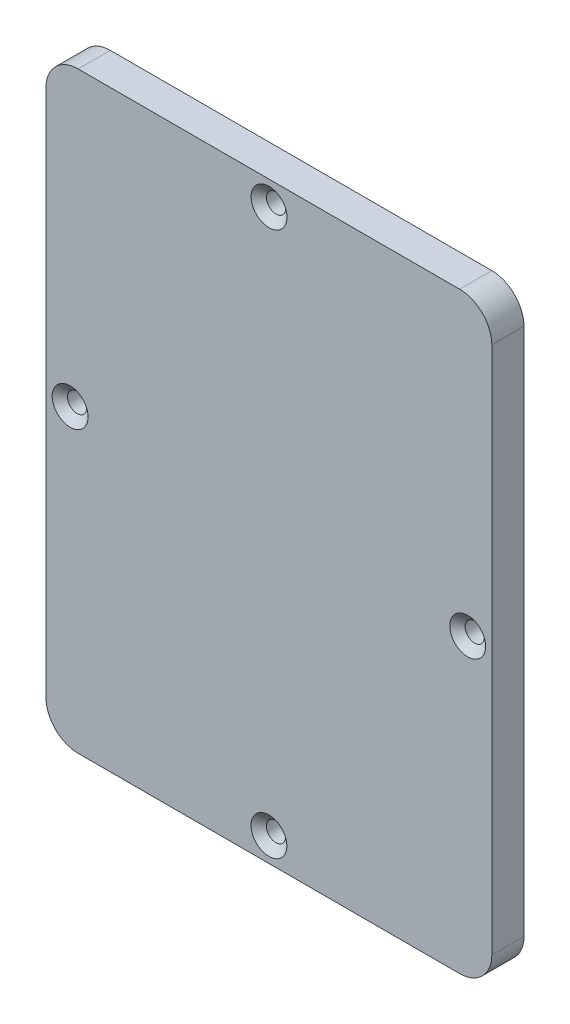
ISO-10303-21;
HEADER;
FILE_DESCRIPTION(('STEP AP214'),'2;1');
FILE_NAME('part.step','',(''),(''),'','','');
FILE_SCHEMA(('AUTOMOTIVE_DESIGN { 1 0 10303 214 1 1 1 1 }'));
ENDSEC;
DATA;
#1=APPLICATION_CONTEXT('core data for automotive mechanical design processes');
#2=APPLICATION_PROTOCOL_DEFINITION('international standard','automotive_design',2000,#1);
#3=PRODUCT_CONTEXT('',#1,'mechanical');
#4=PRODUCT('Part','Part','',(#3));
#5=PRODUCT_RELATED_PRODUCT_CATEGORY('part','',(#4));
#6=PRODUCT_DEFINITION_FORMATION('','',#4);
#7=PRODUCT_DEFINITION_CONTEXT('part definition',#1,'design');
#8=PRODUCT_DEFINITION('design','',#6,#7);
#9=PRODUCT_DEFINITION_SHAPE('','',#8);
#10=(LENGTH_UNIT() NAMED_UNIT(*) SI_UNIT(.MILLI.,.METRE.));
#11=(NAMED_UNIT(*) PLANE_ANGLE_UNIT() SI_UNIT($,.RADIAN.));
#12=(NAMED_UNIT(*) SI_UNIT($,.STERADIAN.) SOLID_ANGLE_UNIT());
#13=UNCERTAINTY_MEASURE_WITH_UNIT(LENGTH_MEASURE(1.E-05),#10,'distance_accuracy_value','');
#14=(GEOMETRIC_REPRESENTATION_CONTEXT(3) GLOBAL_UNCERTAINTY_ASSIGNED_CONTEXT((#13)) GLOBAL_UNIT_ASSIGNED_CONTEXT((#10,
#11,#12)) REPRESENTATION_CONTEXT('',''));
#15=CARTESIAN_POINT('',(0.,0.,0.));
#16=DIRECTION('',(0.,0.,1.));
#17=DIRECTION('',(1.,0.,0.));
#18=AXIS2_PLACEMENT_3D('',#15,#16,#17);
#19=CARTESIAN_POINT('',(0.,6.34999999999997,6.35));
#20=DIRECTION('',(0.,0.,1.));
#21=DIRECTION('',(1.,0.,0.));
#22=AXIS2_PLACEMENT_3D('',#19,#20,#21);
#23=PLANE('',#22);
#24=CARTESIAN_POINT('',(-1.58750000000013,58.5,6.35));
#25=DIRECTION('',(0.,0.,1.));
#26=DIRECTION('',(1.,0.,0.));
#27=AXIS2_PLACEMENT_3D('',#24,#25,#26);
#28=CIRCLE('',#27,3.5433);
#29=CARTESIAN_POINT('',(1.95579999999987,58.5,6.35));
#30=VERTEX_POINT('',#29);
#31=EDGE_CURVE('E209',#30,#30,#28,.T.);
#32=ORIENTED_EDGE('',*,*,#31,.F.);
#33=EDGE_LOOP('',(#32));
#34=FACE_BOUND('',#33,.T.);
#35=CARTESIAN_POINT('',(37.6737898081058,112.2375,6.35));
#36=DIRECTION('',(0.,0.,1.));
#37=DIRECTION('',(1.,0.,0.));
#38=AXIS2_PLACEMENT_3D('',#35,#36,#37);
#39=CIRCLE('',#38,3.5433);
#40=CARTESIAN_POINT('',(41.2170898081058,112.2375,6.35));
#41=VERTEX_POINT('',#40);
#42=EDGE_CURVE('E200',#41,#41,#39,.T.);
#43=ORIENTED_EDGE('',*,*,#42,.F.);
#44=EDGE_LOOP('',(#43));
#45=FACE_BOUND('',#44,.T.);
#46=CARTESIAN_POINT('',(76.8874999999999,58.5,6.35));
#47=DIRECTION('',(0.,0.,1.));
#48=DIRECTION('',(1.,0.,0.));
#49=AXIS2_PLACEMENT_3D('',#46,#47,#48);
#50=CIRCLE('',#49,3.5433);
#51=CARTESIAN_POINT('',(80.4307999999999,58.5,6.35));
#52=VERTEX_POINT('',#51);
#53=EDGE_CURVE('E191',#52,#52,#50,.T.);
#54=ORIENTED_EDGE('',*,*,#53,.F.);
#55=EDGE_LOOP('',(#54));
#56=FACE_BOUND('',#55,.T.);
#57=CARTESIAN_POINT('',(37.6499999999999,4.7625,6.35));
#58=DIRECTION('',(0.,0.,1.));
#59=DIRECTION('',(1.,0.,0.));
#60=AXIS2_PLACEMENT_3D('',#57,#58,#59);
#61=CIRCLE('',#60,3.5433);
#62=CARTESIAN_POINT('',(41.1932999999999,4.7625,6.35));
#63=VERTEX_POINT('',#62);
#64=EDGE_CURVE('E182',#63,#63,#61,.T.);
#65=ORIENTED_EDGE('',*,*,#64,.F.);
#66=EDGE_LOOP('',(#65));
#67=FACE_BOUND('',#66,.T.);
#68=CARTESIAN_POINT('',(0.,6.34999999999997,6.35));
#69=DIRECTION('',(0.,0.,1.));
#70=DIRECTION('',(1.,0.,0.));
#71=AXIS2_PLACEMENT_3D('',#68,#69,#70);
#72=CIRCLE('',#71,6.35000000000001);
#73=CARTESIAN_POINT('',(-6.35000000000007,6.34999999999997,6.35));
#74=VERTEX_POINT('',#73);
#75=CARTESIAN_POINT('',(0.,0.,6.35));
#76=VERTEX_POINT('',#75);
#77=EDGE_CURVE('E144',#74,#76,#72,.T.);
#78=ORIENTED_EDGE('',*,*,#77,.T.);
#79=DIRECTION('',(1.,0.,0.));
#80=VECTOR('',#79,1.);
#81=CARTESIAN_POINT('',(0.,0.,6.35));
#82=LINE('',#81,#80);
#83=CARTESIAN_POINT('',(75.3,0.,6.35));
#84=VERTEX_POINT('',#83);
#85=EDGE_CURVE('E93',#76,#84,#82,.T.);
#86=ORIENTED_EDGE('',*,*,#85,.T.);
#87=CARTESIAN_POINT('',(75.3,6.35000000000006,6.35));
#88=DIRECTION('',(0.,0.,1.));
#89=DIRECTION('',(1.,0.,0.));
#90=AXIS2_PLACEMENT_3D('',#87,#88,#89);
#91=CIRCLE('',#90,6.34999999999997);
#92=CARTESIAN_POINT('',(81.6499999999999,6.34999999999998,6.35));
#93=VERTEX_POINT('',#92);
#94=EDGE_CURVE('E159',#84,#93,#91,.T.);
#95=ORIENTED_EDGE('',*,*,#94,.T.);
#96=DIRECTION('',(0.,1.,0.));
#97=VECTOR('',#96,1.);
#98=CARTESIAN_POINT('',(81.6499999999999,6.34999999999998,6.35));
#99=LINE('',#98,#97);
#100=CARTESIAN_POINT('',(81.6499999999999,110.65,6.35));
#101=VERTEX_POINT('',#100);
#102=EDGE_CURVE('E171',#93,#101,#99,.T.);
#103=ORIENTED_EDGE('',*,*,#102,.T.);
#104=CARTESIAN_POINT('',(75.2999999999999,110.65,6.35));
#105=DIRECTION('',(0.,0.,1.));
#106=DIRECTION('',(1.,0.,0.));
#107=AXIS2_PLACEMENT_3D('',#104,#105,#106);
#108=CIRCLE('',#107,6.35000000000002);
#109=CARTESIAN_POINT('',(75.2999999999999,117.,6.35));
#110=VERTEX_POINT('',#109);
#111=EDGE_CURVE('E111',#101,#110,#108,.T.);
#112=ORIENTED_EDGE('',*,*,#111,.T.);
#113=DIRECTION('',(-1.,0.,0.));
#114=VECTOR('',#113,1.);
#115=CARTESIAN_POINT('',(75.2999999999999,117.,6.35));
#116=LINE('',#115,#114);
#117=CARTESIAN_POINT('',(0.,117.,6.35));
#118=VERTEX_POINT('',#117);
#119=EDGE_CURVE('E106',#110,#118,#116,.T.);
#120=ORIENTED_EDGE('',*,*,#119,.T.);
#121=CARTESIAN_POINT('',(0.,110.65,6.35));
#122=DIRECTION('',(0.,0.,1.));
#123=DIRECTION('',(1.,0.,0.));
#124=AXIS2_PLACEMENT_3D('',#121,#122,#123);
#125=CIRCLE('',#124,6.35000000000002);
#126=CARTESIAN_POINT('',(-6.35000000000013,110.65,6.35));
#127=VERTEX_POINT('',#126);
#128=EDGE_CURVE('E109',#118,#127,#125,.T.);
#129=ORIENTED_EDGE('',*,*,#128,.T.);
#130=DIRECTION('',(0.,-1.,0.));
#131=VECTOR('',#130,1.);
#132=CARTESIAN_POINT('',(-6.35000000000013,110.65,6.35));
#133=LINE('',#132,#131);
#134=EDGE_CURVE('E50',#127,#74,#133,.T.);
#135=ORIENTED_EDGE('',*,*,#134,.T.);
#136=EDGE_LOOP('',(#78,#86,#95,#103,#112,#120,#129,#135));
#137=FACE_BOUND('',#136,.T.);
#138=ADVANCED_FACE('F33',(#34,#45,#56,#67,#137),#23,.T.);
#139=CARTESIAN_POINT('',(0.,6.34999999999997,0.));
#140=DIRECTION('',(0.,0.,1.));
#141=DIRECTION('',(1.,0.,0.));
#142=AXIS2_PLACEMENT_3D('',#139,#140,#141);
#143=PLANE('',#142);
#144=CARTESIAN_POINT('',(-1.58750000000013,58.5,0.));
#145=DIRECTION('',(0.,0.,1.));
#146=DIRECTION('',(1.,0.,0.));
#147=AXIS2_PLACEMENT_3D('',#144,#145,#146);
#148=CIRCLE('',#147,1.89864999999999);
#149=CARTESIAN_POINT('',(0.311149999999859,58.5,0.));
#150=VERTEX_POINT('',#149);
#151=EDGE_CURVE('E203',#150,#150,#148,.T.);
#152=ORIENTED_EDGE('',*,*,#151,.T.);
#153=EDGE_LOOP('',(#152));
#154=FACE_BOUND('',#153,.T.);
#155=CARTESIAN_POINT('',(37.6737898081058,112.2375,0.));
#156=DIRECTION('',(0.,0.,1.));
#157=DIRECTION('',(1.,0.,0.));
#158=AXIS2_PLACEMENT_3D('',#155,#156,#157);
#159=CIRCLE('',#158,1.89864999999999);
#160=CARTESIAN_POINT('',(39.5724398081058,112.2375,0.));
#161=VERTEX_POINT('',#160);
#162=EDGE_CURVE('E194',#161,#161,#159,.T.);
#163=ORIENTED_EDGE('',*,*,#162,.T.);
#164=EDGE_LOOP('',(#163));
#165=FACE_BOUND('',#164,.T.);
#166=CARTESIAN_POINT('',(76.8874999999999,58.5,0.));
#167=DIRECTION('',(0.,0.,1.));
#168=DIRECTION('',(1.,0.,0.));
#169=AXIS2_PLACEMENT_3D('',#166,#167,#168);
#170=CIRCLE('',#169,1.89864999999999);
#171=CARTESIAN_POINT('',(78.7861499999999,58.5,0.));
#172=VERTEX_POINT('',#171);
#173=EDGE_CURVE('E185',#172,#172,#170,.T.);
#174=ORIENTED_EDGE('',*,*,#173,.T.);
#175=EDGE_LOOP('',(#174));
#176=FACE_BOUND('',#175,.T.);
#177=CARTESIAN_POINT('',(37.6499999999999,4.7625,0.));
#178=DIRECTION('',(0.,0.,1.));
#179=DIRECTION('',(1.,0.,0.));
#180=AXIS2_PLACEMENT_3D('',#177,#178,#179);
#181=CIRCLE('',#180,1.89864999999999);
#182=CARTESIAN_POINT('',(39.5486499999999,4.7625,0.));
#183=VERTEX_POINT('',#182);
#184=EDGE_CURVE('E133',#183,#183,#181,.T.);
#185=ORIENTED_EDGE('',*,*,#184,.T.);
#186=EDGE_LOOP('',(#185));
#187=FACE_BOUND('',#186,.T.);
#188=CARTESIAN_POINT('',(0.,6.34999999999997,0.));
#189=DIRECTION('',(0.,0.,1.));
#190=DIRECTION('',(1.,0.,0.));
#191=AXIS2_PLACEMENT_3D('',#188,#189,#190);
#192=CIRCLE('',#191,6.35000000000001);
#193=CARTESIAN_POINT('',(-6.35000000000007,6.34999999999997,0.));
#194=VERTEX_POINT('',#193);
#195=CARTESIAN_POINT('',(0.,0.,0.));
#196=VERTEX_POINT('',#195);
#197=EDGE_CURVE('E129',#194,#196,#192,.T.);
#198=ORIENTED_EDGE('',*,*,#197,.F.);
#199=DIRECTION('',(0.,-1.,0.));
#200=VECTOR('',#199,1.);
#201=CARTESIAN_POINT('',(-6.35000000000013,110.65,0.));
#202=LINE('',#201,#200);
#203=CARTESIAN_POINT('',(-6.35000000000013,110.65,0.));
#204=VERTEX_POINT('',#203);
#205=EDGE_CURVE('E85',#204,#194,#202,.T.);
#206=ORIENTED_EDGE('',*,*,#205,.F.);
#207=CARTESIAN_POINT('',(0.,110.65,0.));
#208=DIRECTION('',(0.,0.,1.));
#209=DIRECTION('',(1.,0.,0.));
#210=AXIS2_PLACEMENT_3D('',#207,#208,#209);
#211=CIRCLE('',#210,6.35000000000002);
#212=CARTESIAN_POINT('',(0.,117.,0.));
#213=VERTEX_POINT('',#212);
#214=EDGE_CURVE('E79',#213,#204,#211,.T.);
#215=ORIENTED_EDGE('',*,*,#214,.F.);
#216=DIRECTION('',(-1.,0.,0.));
#217=VECTOR('',#216,1.);
#218=CARTESIAN_POINT('',(75.2999999999999,117.,0.));
#219=LINE('',#218,#217);
#220=CARTESIAN_POINT('',(75.2999999999999,117.,0.));
#221=VERTEX_POINT('',#220);
#222=EDGE_CURVE('E119',#221,#213,#219,.T.);
#223=ORIENTED_EDGE('',*,*,#222,.F.);
#224=CARTESIAN_POINT('',(75.2999999999999,110.65,0.));
#225=DIRECTION('',(0.,0.,1.));
#226=DIRECTION('',(1.,0.,0.));
#227=AXIS2_PLACEMENT_3D('',#224,#225,#226);
#228=CIRCLE('',#227,6.35000000000002);
#229=CARTESIAN_POINT('',(81.6499999999999,110.65,0.));
#230=VERTEX_POINT('',#229);
#231=EDGE_CURVE('E139',#230,#221,#228,.T.);
#232=ORIENTED_EDGE('',*,*,#231,.F.);
#233=DIRECTION('',(0.,1.,0.));
#234=VECTOR('',#233,1.);
#235=CARTESIAN_POINT('',(81.6499999999999,6.34999999999998,0.));
#236=LINE('',#235,#234);
#237=CARTESIAN_POINT('',(81.6499999999999,6.34999999999998,0.));
#238=VERTEX_POINT('',#237);
#239=EDGE_CURVE('E137',#238,#230,#236,.T.);
#240=ORIENTED_EDGE('',*,*,#239,.F.);
#241=CARTESIAN_POINT('',(75.3,6.35000000000006,0.));
#242=DIRECTION('',(0.,0.,1.));
#243=DIRECTION('',(1.,0.,0.));
#244=AXIS2_PLACEMENT_3D('',#241,#242,#243);
#245=CIRCLE('',#244,6.34999999999997);
#246=CARTESIAN_POINT('',(75.3,0.,0.));
#247=VERTEX_POINT('',#246);
#248=EDGE_CURVE('E135',#247,#238,#245,.T.);
#249=ORIENTED_EDGE('',*,*,#248,.F.);
#250=DIRECTION('',(1.,0.,0.));
#251=VECTOR('',#250,1.);
#252=CARTESIAN_POINT('',(0.,0.,0.));
#253=LINE('',#252,#251);
#254=EDGE_CURVE('E132',#196,#247,#253,.T.);
#255=ORIENTED_EDGE('',*,*,#254,.F.);
#256=EDGE_LOOP('',(#198,#206,#215,#223,#232,#240,#249,#255));
#257=FACE_BOUND('',#256,.T.);
#258=ADVANCED_FACE('F163',(#154,#165,#176,#187,#257),#143,.F.);
#259=CARTESIAN_POINT('',(0.,6.34999999999997,6.35));
#260=DIRECTION('',(0.,0.,-1.));
#261=DIRECTION('',(-1.,0.,0.));
#262=AXIS2_PLACEMENT_3D('',#259,#260,#261);
#263=CYLINDRICAL_SURFACE('',#262,6.35000000000001);
#264=ORIENTED_EDGE('',*,*,#197,.T.);
#265=DIRECTION('',(0.,0.,-1.));
#266=VECTOR('',#265,1.);
#267=CARTESIAN_POINT('',(0.,0.,6.35));
#268=LINE('',#267,#266);
#269=EDGE_CURVE('E11',#76,#196,#268,.T.);
#270=ORIENTED_EDGE('',*,*,#269,.F.);
#271=ORIENTED_EDGE('',*,*,#77,.F.);
#272=DIRECTION('',(0.,0.,-1.));
#273=VECTOR('',#272,1.);
#274=CARTESIAN_POINT('',(-6.35000000000007,6.34999999999997,6.35));
#275=LINE('',#274,#273);
#276=EDGE_CURVE('E125',#74,#194,#275,.T.);
#277=ORIENTED_EDGE('',*,*,#276,.T.);
#278=EDGE_LOOP('',(#264,#270,#271,#277));
#279=FACE_BOUND('',#278,.T.);
#280=ADVANCED_FACE('F35',(#279),#263,.T.);
#281=CARTESIAN_POINT('',(0.,0.,6.35));
#282=DIRECTION('',(0.,1.,0.));
#283=DIRECTION('',(-1.,0.,0.));
#284=AXIS2_PLACEMENT_3D('',#281,#282,#283);
#285=PLANE('',#284);
#286=ORIENTED_EDGE('',*,*,#254,.T.);
#287=DIRECTION('',(0.,0.,-1.));
#288=VECTOR('',#287,1.);
#289=CARTESIAN_POINT('',(75.3,0.,6.35));
#290=LINE('',#289,#288);
#291=EDGE_CURVE('E42',#84,#247,#290,.T.);
#292=ORIENTED_EDGE('',*,*,#291,.F.);
#293=ORIENTED_EDGE('',*,*,#85,.F.);
#294=ORIENTED_EDGE('',*,*,#269,.T.);
#295=EDGE_LOOP('',(#286,#292,#293,#294));
#296=FACE_BOUND('',#295,.T.);
#297=ADVANCED_FACE('F257',(#296),#285,.F.);
#298=CARTESIAN_POINT('',(75.3,6.35000000000006,6.35));
#299=DIRECTION('',(0.,0.,-1.));
#300=DIRECTION('',(-1.,0.,0.));
#301=AXIS2_PLACEMENT_3D('',#298,#299,#300);
#302=CYLINDRICAL_SURFACE('',#301,6.34999999999997);
#303=ORIENTED_EDGE('',*,*,#248,.T.);
#304=DIRECTION('',(0.,0.,-1.));
#305=VECTOR('',#304,1.);
#306=CARTESIAN_POINT('',(81.6499999999999,6.34999999999998,6.35));
#307=LINE('',#306,#305);
#308=EDGE_CURVE('E151',#93,#238,#307,.T.);
#309=ORIENTED_EDGE('',*,*,#308,.F.);
#310=ORIENTED_EDGE('',*,*,#94,.F.);
#311=ORIENTED_EDGE('',*,*,#291,.T.);
#312=EDGE_LOOP('',(#303,#309,#310,#311));
#313=FACE_BOUND('',#312,.T.);
#314=ADVANCED_FACE('F157',(#313),#302,.T.);
#315=CARTESIAN_POINT('',(81.6499999999999,6.34999999999998,6.35));
#316=DIRECTION('',(-1.,0.,0.));
#317=DIRECTION('',(0.,-1.,0.));
#318=AXIS2_PLACEMENT_3D('',#315,#316,#317);
#319=PLANE('',#318);
#320=ORIENTED_EDGE('',*,*,#239,.T.);
#321=DIRECTION('',(0.,0.,-1.));
#322=VECTOR('',#321,1.);
#323=CARTESIAN_POINT('',(81.6499999999999,110.65,6.35));
#324=LINE('',#323,#322);
#325=EDGE_CURVE('E148',#101,#230,#324,.T.);
#326=ORIENTED_EDGE('',*,*,#325,.F.);
#327=ORIENTED_EDGE('',*,*,#102,.F.);
#328=ORIENTED_EDGE('',*,*,#308,.T.);
#329=EDGE_LOOP('',(#320,#326,#327,#328));
#330=FACE_BOUND('',#329,.T.);
#331=ADVANCED_FACE('F167',(#330),#319,.F.);
#332=CARTESIAN_POINT('',(75.2999999999999,110.65,6.35));
#333=DIRECTION('',(0.,0.,-1.));
#334=DIRECTION('',(-1.,0.,0.));
#335=AXIS2_PLACEMENT_3D('',#332,#333,#334);
#336=CYLINDRICAL_SURFACE('',#335,6.35000000000002);
#337=ORIENTED_EDGE('',*,*,#231,.T.);
#338=DIRECTION('',(0.,0.,-1.));
#339=VECTOR('',#338,1.);
#340=CARTESIAN_POINT('',(75.2999999999999,117.,6.35));
#341=LINE('',#340,#339);
#342=EDGE_CURVE('E120',#110,#221,#341,.T.);
#343=ORIENTED_EDGE('',*,*,#342,.F.);
#344=ORIENTED_EDGE('',*,*,#111,.F.);
#345=ORIENTED_EDGE('',*,*,#325,.T.);
#346=EDGE_LOOP('',(#337,#343,#344,#345));
#347=FACE_BOUND('',#346,.T.);
#348=ADVANCED_FACE('F170',(#347),#336,.T.);
#349=CARTESIAN_POINT('',(75.2999999999999,117.,6.35));
#350=DIRECTION('',(0.,-1.,0.));
#351=DIRECTION('',(1.,0.,0.));
#352=AXIS2_PLACEMENT_3D('',#349,#350,#351);
#353=PLANE('',#352);
#354=ORIENTED_EDGE('',*,*,#222,.T.);
#355=DIRECTION('',(0.,0.,-1.));
#356=VECTOR('',#355,1.);
#357=CARTESIAN_POINT('',(0.,117.,6.35));
#358=LINE('',#357,#356);
#359=EDGE_CURVE('E116',#118,#213,#358,.T.);
#360=ORIENTED_EDGE('',*,*,#359,.F.);
#361=ORIENTED_EDGE('',*,*,#119,.F.);
#362=ORIENTED_EDGE('',*,*,#342,.T.);
#363=EDGE_LOOP('',(#354,#360,#361,#362));
#364=FACE_BOUND('',#363,.T.);
#365=ADVANCED_FACE('F117',(#364),#353,.F.);
#366=CARTESIAN_POINT('',(0.,110.65,6.35));
#367=DIRECTION('',(0.,0.,-1.));
#368=DIRECTION('',(-1.,0.,0.));
#369=AXIS2_PLACEMENT_3D('',#366,#367,#368);
#370=CYLINDRICAL_SURFACE('',#369,6.35000000000002);
#371=ORIENTED_EDGE('',*,*,#214,.T.);
#372=DIRECTION('',(0.,0.,-1.));
#373=VECTOR('',#372,1.);
#374=CARTESIAN_POINT('',(-6.35000000000013,110.65,6.35));
#375=LINE('',#374,#373);
#376=EDGE_CURVE('E121',#127,#204,#375,.T.);
#377=ORIENTED_EDGE('',*,*,#376,.F.);
#378=ORIENTED_EDGE('',*,*,#128,.F.);
#379=ORIENTED_EDGE('',*,*,#359,.T.);
#380=EDGE_LOOP('',(#371,#377,#378,#379));
#381=FACE_BOUND('',#380,.T.);
#382=ADVANCED_FACE('F123',(#381),#370,.T.);
#383=CARTESIAN_POINT('',(-6.35000000000013,110.65,6.35));
#384=DIRECTION('',(1.,0.,0.));
#385=DIRECTION('',(0.,1.,0.));
#386=AXIS2_PLACEMENT_3D('',#383,#384,#385);
#387=PLANE('',#386);
#388=ORIENTED_EDGE('',*,*,#205,.T.);
#389=ORIENTED_EDGE('',*,*,#276,.F.);
#390=ORIENTED_EDGE('',*,*,#134,.F.);
#391=ORIENTED_EDGE('',*,*,#376,.T.);
#392=EDGE_LOOP('',(#388,#389,#390,#391));
#393=FACE_BOUND('',#392,.T.);
#394=ADVANCED_FACE('F237',(#393),#387,.F.);
#395=CARTESIAN_POINT('',(37.6499999999999,4.7625,6.35));
#396=DIRECTION('',(0.,0.,1.));
#397=DIRECTION('',(1.,0.,0.));
#398=AXIS2_PLACEMENT_3D('',#395,#396,#397);
#399=CYLINDRICAL_SURFACE('',#398,1.89864999999999);
#400=ORIENTED_EDGE('',*,*,#184,.F.);
#401=EDGE_LOOP('',(#400));
#402=FACE_BOUND('',#401,.T.);
#403=CARTESIAN_POINT('',(37.6499999999999,4.7625,4.96997479158429));
#404=DIRECTION('',(0.,0.,1.));
#405=DIRECTION('',(1.,0.,0.));
#406=AXIS2_PLACEMENT_3D('',#403,#404,#405);
#407=CIRCLE('',#406,1.89864999999999);
#408=CARTESIAN_POINT('',(39.5486499999999,4.7625,4.96997479158429));
#409=VERTEX_POINT('',#408);
#410=EDGE_CURVE('E179',#409,#409,#407,.T.);
#411=ORIENTED_EDGE('',*,*,#410,.T.);
#412=EDGE_LOOP('',(#411));
#413=FACE_BOUND('',#412,.T.);
#414=ADVANCED_FACE('F227',(#402,#413),#399,.F.);
#415=CARTESIAN_POINT('',(37.6499999999999,4.7625,6.35));
#416=DIRECTION('',(0.,0.,1.));
#417=DIRECTION('',(1.,0.,0.));
#418=AXIS2_PLACEMENT_3D('',#415,#416,#417);
#419=CONICAL_SURFACE('',#418,3.5433,0.872664625997169);
#420=ORIENTED_EDGE('',*,*,#410,.F.);
#421=EDGE_LOOP('',(#420));
#422=FACE_BOUND('',#421,.T.);
#423=ORIENTED_EDGE('',*,*,#64,.T.);
#424=EDGE_LOOP('',(#423));
#425=FACE_BOUND('',#424,.T.);
#426=ADVANCED_FACE('F224',(#422,#425),#419,.F.);
#427=CARTESIAN_POINT('',(76.8874999999999,58.5,6.35));
#428=DIRECTION('',(0.,0.,1.));
#429=DIRECTION('',(1.,0.,0.));
#430=AXIS2_PLACEMENT_3D('',#427,#428,#429);
#431=CYLINDRICAL_SURFACE('',#430,1.89864999999999);
#432=ORIENTED_EDGE('',*,*,#173,.F.);
#433=EDGE_LOOP('',(#432));
#434=FACE_BOUND('',#433,.T.);
#435=CARTESIAN_POINT('',(76.8874999999999,58.5,4.96997479158429));
#436=DIRECTION('',(0.,0.,1.));
#437=DIRECTION('',(1.,0.,0.));
#438=AXIS2_PLACEMENT_3D('',#435,#436,#437);
#439=CIRCLE('',#438,1.89864999999999);
#440=CARTESIAN_POINT('',(78.7861499999999,58.5,4.96997479158429));
#441=VERTEX_POINT('',#440);
#442=EDGE_CURVE('E188',#441,#441,#439,.T.);
#443=ORIENTED_EDGE('',*,*,#442,.T.);
#444=EDGE_LOOP('',(#443));
#445=FACE_BOUND('',#444,.T.);
#446=ADVANCED_FACE('F226',(#434,#445),#431,.F.);
#447=CARTESIAN_POINT('',(76.8874999999999,58.5,6.35));
#448=DIRECTION('',(0.,0.,1.));
#449=DIRECTION('',(1.,0.,0.));
#450=AXIS2_PLACEMENT_3D('',#447,#448,#449);
#451=CONICAL_SURFACE('',#450,3.5433,0.872664625997169);
#452=ORIENTED_EDGE('',*,*,#442,.F.);
#453=EDGE_LOOP('',(#452));
#454=FACE_BOUND('',#453,.T.);
#455=ORIENTED_EDGE('',*,*,#53,.T.);
#456=EDGE_LOOP('',(#455));
#457=FACE_BOUND('',#456,.T.);
#458=ADVANCED_FACE('F234',(#454,#457),#451,.F.);
#459=CARTESIAN_POINT('',(37.6737898081058,112.2375,6.35));
#460=DIRECTION('',(0.,0.,1.));
#461=DIRECTION('',(1.,0.,0.));
#462=AXIS2_PLACEMENT_3D('',#459,#460,#461);
#463=CYLINDRICAL_SURFACE('',#462,1.89864999999999);
#464=ORIENTED_EDGE('',*,*,#162,.F.);
#465=EDGE_LOOP('',(#464));
#466=FACE_BOUND('',#465,.T.);
#467=CARTESIAN_POINT('',(37.6737898081058,112.2375,4.96997479158429));
#468=DIRECTION('',(0.,0.,1.));
#469=DIRECTION('',(1.,0.,0.));
#470=AXIS2_PLACEMENT_3D('',#467,#468,#469);
#471=CIRCLE('',#470,1.89864999999999);
#472=CARTESIAN_POINT('',(39.5724398081058,112.2375,4.96997479158429));
#473=VERTEX_POINT('',#472);
#474=EDGE_CURVE('E197',#473,#473,#471,.T.);
#475=ORIENTED_EDGE('',*,*,#474,.T.);
#476=EDGE_LOOP('',(#475));
#477=FACE_BOUND('',#476,.T.);
#478=ADVANCED_FACE('F344',(#466,#477),#463,.F.);
#479=CARTESIAN_POINT('',(37.6737898081058,112.2375,6.35));
#480=DIRECTION('',(0.,0.,1.));
#481=DIRECTION('',(1.,0.,0.));
#482=AXIS2_PLACEMENT_3D('',#479,#480,#481);
#483=CONICAL_SURFACE('',#482,3.5433,0.872664625997169);
#484=ORIENTED_EDGE('',*,*,#474,.F.);
#485=EDGE_LOOP('',(#484));
#486=FACE_BOUND('',#485,.T.);
#487=ORIENTED_EDGE('',*,*,#42,.T.);
#488=EDGE_LOOP('',(#487));
#489=FACE_BOUND('',#488,.T.);
#490=ADVANCED_FACE('F353',(#486,#489),#483,.F.);
#491=CARTESIAN_POINT('',(-1.58750000000013,58.5,6.35));
#492=DIRECTION('',(0.,0.,1.));
#493=DIRECTION('',(1.,0.,0.));
#494=AXIS2_PLACEMENT_3D('',#491,#492,#493);
#495=CYLINDRICAL_SURFACE('',#494,1.89864999999999);
#496=ORIENTED_EDGE('',*,*,#151,.F.);
#497=EDGE_LOOP('',(#496));
#498=FACE_BOUND('',#497,.T.);
#499=CARTESIAN_POINT('',(-1.58750000000013,58.5,4.96997479158429));
#500=DIRECTION('',(0.,0.,1.));
#501=DIRECTION('',(1.,0.,0.));
#502=AXIS2_PLACEMENT_3D('',#499,#500,#501);
#503=CIRCLE('',#502,1.89864999999999);
#504=CARTESIAN_POINT('',(0.311149999999859,58.5,4.96997479158429));
#505=VERTEX_POINT('',#504);
#506=EDGE_CURVE('E206',#505,#505,#503,.T.);
#507=ORIENTED_EDGE('',*,*,#506,.T.);
#508=EDGE_LOOP('',(#507));
#509=FACE_BOUND('',#508,.T.);
#510=ADVANCED_FACE('F363',(#498,#509),#495,.F.);
#511=CARTESIAN_POINT('',(-1.58750000000013,58.5,6.35));
#512=DIRECTION('',(0.,0.,1.));
#513=DIRECTION('',(1.,0.,0.));
#514=AXIS2_PLACEMENT_3D('',#511,#512,#513);
#515=CONICAL_SURFACE('',#514,3.5433,0.872664625997169);
#516=ORIENTED_EDGE('',*,*,#506,.F.);
#517=EDGE_LOOP('',(#516));
#518=FACE_BOUND('',#517,.T.);
#519=ORIENTED_EDGE('',*,*,#31,.T.);
#520=EDGE_LOOP('',(#519));
#521=FACE_BOUND('',#520,.T.);
#522=ADVANCED_FACE('F213',(#518,#521),#515,.F.);
#523=CLOSED_SHELL('',(#138,#258,#280,#297,#314,#331,#348,#365,#382,#394,#414,#426,#446,#458,
#478,#490,#510,#522));
#524=MANIFOLD_SOLID_BREP('B2',#523);
#525=ADVANCED_BREP_SHAPE_REPRESENTATION('',(#18,#524),#14);
#526=SHAPE_DEFINITION_REPRESENTATION(#9,#525);
ENDSEC;
END-ISO-10303-21;
